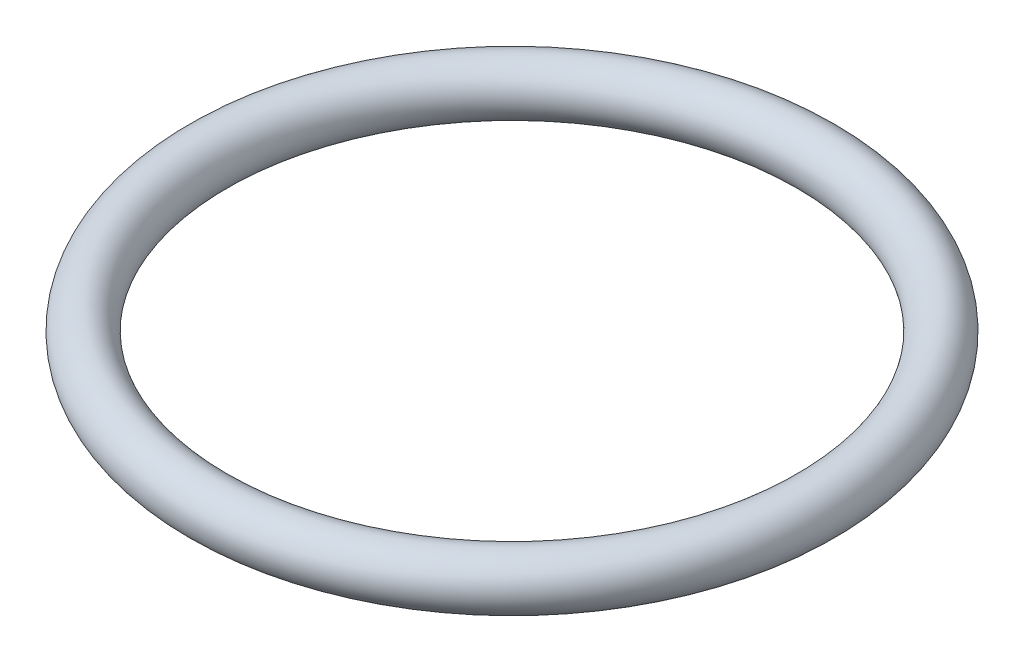
ISO-10303-21;
HEADER;
FILE_DESCRIPTION(('STEP AP214'),'2;1');
FILE_NAME('part.step','',(''),(''),'','','');
FILE_SCHEMA(('AUTOMOTIVE_DESIGN { 1 0 10303 214 1 1 1 1 }'));
ENDSEC;
DATA;
#1=APPLICATION_CONTEXT('core data for automotive mechanical design processes');
#2=APPLICATION_PROTOCOL_DEFINITION('international standard','automotive_design',2000,#1);
#3=PRODUCT_CONTEXT('',#1,'mechanical');
#4=PRODUCT('Part','Part','',(#3));
#5=PRODUCT_RELATED_PRODUCT_CATEGORY('part','',(#4));
#6=PRODUCT_DEFINITION_FORMATION('','',#4);
#7=PRODUCT_DEFINITION_CONTEXT('part definition',#1,'design');
#8=PRODUCT_DEFINITION('design','',#6,#7);
#9=PRODUCT_DEFINITION_SHAPE('','',#8);
#10=(LENGTH_UNIT() NAMED_UNIT(*) SI_UNIT(.MILLI.,.METRE.));
#11=(NAMED_UNIT(*) PLANE_ANGLE_UNIT() SI_UNIT($,.RADIAN.));
#12=(NAMED_UNIT(*) SI_UNIT($,.STERADIAN.) SOLID_ANGLE_UNIT());
#13=UNCERTAINTY_MEASURE_WITH_UNIT(LENGTH_MEASURE(1.E-05),#10,'distance_accuracy_value','');
#14=(GEOMETRIC_REPRESENTATION_CONTEXT(3) GLOBAL_UNCERTAINTY_ASSIGNED_CONTEXT((#13)) GLOBAL_UNIT_ASSIGNED_CONTEXT((#10,
#11,#12)) REPRESENTATION_CONTEXT('',''));
#15=CARTESIAN_POINT('',(0.,0.,0.));
#16=DIRECTION('',(0.,0.,1.));
#17=DIRECTION('',(1.,0.,0.));
#18=AXIS2_PLACEMENT_3D('',#15,#16,#17);
#19=CARTESIAN_POINT('',(0.,0.,0.));
#20=DIRECTION('',(0.,-1.,0.));
#21=DIRECTION('',(0.,0.,-1.));
#22=AXIS2_PLACEMENT_3D('',#19,#20,#21);
#23=TOROIDAL_SURFACE('',#22,10.2743,0.889);
#24=CARTESIAN_POINT('',(0.,0.,-11.1633));
#25=VERTEX_POINT('',#24);
#26=VERTEX_LOOP('',#25);
#27=FACE_BOUND('',#26,.T.);
#28=ADVANCED_FACE('F28',(#27),#23,.T.);
#29=CLOSED_SHELL('',(#28));
#30=MANIFOLD_SOLID_BREP('B2',#29);
#31=ADVANCED_BREP_SHAPE_REPRESENTATION('',(#18,#30),#14);
#32=SHAPE_DEFINITION_REPRESENTATION(#9,#31);
ENDSEC;
END-ISO-10303-21;
